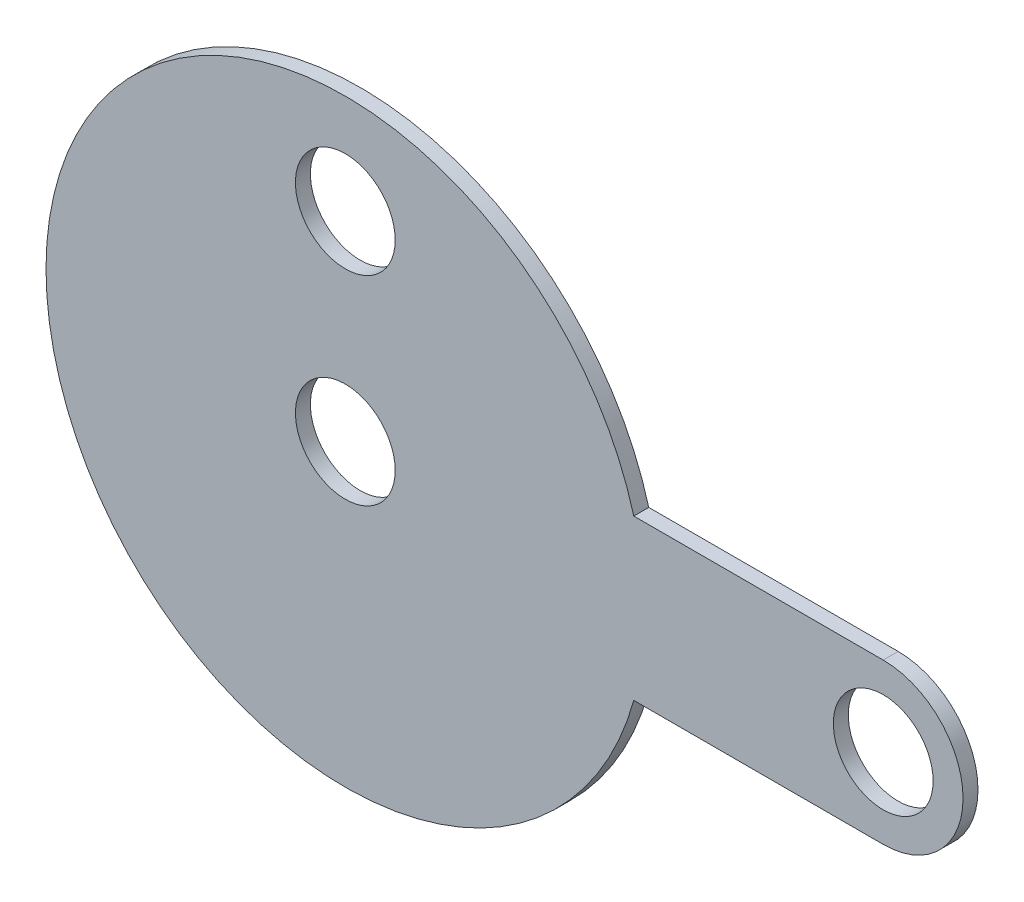
ISO-10303-21;
HEADER;
FILE_DESCRIPTION(('STEP AP214'),'2;1');
FILE_NAME('part.step','',(''),(''),'','','');
FILE_SCHEMA(('AUTOMOTIVE_DESIGN { 1 0 10303 214 1 1 1 1 }'));
ENDSEC;
DATA;
#1=APPLICATION_CONTEXT('core data for automotive mechanical design processes');
#2=APPLICATION_PROTOCOL_DEFINITION('international standard','automotive_design',2000,#1);
#3=PRODUCT_CONTEXT('',#1,'mechanical');
#4=PRODUCT('Part','Part','',(#3));
#5=PRODUCT_RELATED_PRODUCT_CATEGORY('part','',(#4));
#6=PRODUCT_DEFINITION_FORMATION('','',#4);
#7=PRODUCT_DEFINITION_CONTEXT('part definition',#1,'design');
#8=PRODUCT_DEFINITION('design','',#6,#7);
#9=PRODUCT_DEFINITION_SHAPE('','',#8);
#10=(LENGTH_UNIT() NAMED_UNIT(*) SI_UNIT(.MILLI.,.METRE.));
#11=(NAMED_UNIT(*) PLANE_ANGLE_UNIT() SI_UNIT($,.RADIAN.));
#12=(NAMED_UNIT(*) SI_UNIT($,.STERADIAN.) SOLID_ANGLE_UNIT());
#13=UNCERTAINTY_MEASURE_WITH_UNIT(LENGTH_MEASURE(1.E-05),#10,'distance_accuracy_value','');
#14=(GEOMETRIC_REPRESENTATION_CONTEXT(3) GLOBAL_UNCERTAINTY_ASSIGNED_CONTEXT((#13)) GLOBAL_UNIT_ASSIGNED_CONTEXT((#10,
#11,#12)) REPRESENTATION_CONTEXT('',''));
#15=CARTESIAN_POINT('',(0.,0.,0.));
#16=DIRECTION('',(0.,0.,1.));
#17=DIRECTION('',(1.,0.,0.));
#18=AXIS2_PLACEMENT_3D('',#15,#16,#17);
#19=CARTESIAN_POINT('',(53.9136644718086,0.,1.5));
#20=DIRECTION('',(0.,0.,1.));
#21=DIRECTION('',(1.,0.,0.));
#22=AXIS2_PLACEMENT_3D('',#19,#20,#21);
#23=PLANE('',#22);
#24=CARTESIAN_POINT('',(53.9136644718086,0.,1.5));
#25=DIRECTION('',(0.,0.,1.));
#26=DIRECTION('',(1.,0.,0.));
#27=AXIS2_PLACEMENT_3D('',#24,#25,#26);
#28=CIRCLE('',#27,5.);
#29=CARTESIAN_POINT('',(58.9136644718086,0.,1.5));
#30=VERTEX_POINT('',#29);
#31=EDGE_CURVE('E123',#30,#30,#28,.T.);
#32=ORIENTED_EDGE('',*,*,#31,.F.);
#33=EDGE_LOOP('',(#32));
#34=FACE_BOUND('',#33,.T.);
#35=CARTESIAN_POINT('',(53.9136644718086,0.,1.5));
#36=DIRECTION('',(0.,0.,1.));
#37=DIRECTION('',(1.,0.,0.));
#38=AXIS2_PLACEMENT_3D('',#35,#36,#37);
#39=CIRCLE('',#38,8.);
#40=CARTESIAN_POINT('',(53.9136645896019,-8.,1.5));
#41=VERTEX_POINT('',#40);
#42=CARTESIAN_POINT('',(53.9136645896019,8.,1.5));
#43=VERTEX_POINT('',#42);
#44=EDGE_CURVE('E93',#41,#43,#39,.T.);
#45=ORIENTED_EDGE('',*,*,#44,.T.);
#46=DIRECTION('',(-1.,0.,0.));
#47=VECTOR('',#46,1.);
#48=CARTESIAN_POINT('',(28.9136645896019,8.,1.5));
#49=LINE('',#48,#47);
#50=CARTESIAN_POINT('',(28.9136645896019,8.,1.5));
#51=VERTEX_POINT('',#50);
#52=EDGE_CURVE('E88',#43,#51,#49,.T.);
#53=ORIENTED_EDGE('',*,*,#52,.T.);
#54=CARTESIAN_POINT('',(0.,0.,1.5));
#55=DIRECTION('',(0.,0.,1.));
#56=DIRECTION('',(1.,0.,0.));
#57=AXIS2_PLACEMENT_3D('',#54,#55,#56);
#58=CIRCLE('',#57,30.);
#59=CARTESIAN_POINT('',(28.9136645896019,-8.00000000000001,1.5));
#60=VERTEX_POINT('',#59);
#61=EDGE_CURVE('E91',#51,#60,#58,.T.);
#62=ORIENTED_EDGE('',*,*,#61,.T.);
#63=DIRECTION('',(1.,0.,0.));
#64=VECTOR('',#63,1.);
#65=CARTESIAN_POINT('',(28.9136645896019,-8.,1.5));
#66=LINE('',#65,#64);
#67=EDGE_CURVE('E58',#60,#41,#66,.T.);
#68=ORIENTED_EDGE('',*,*,#67,.T.);
#69=EDGE_LOOP('',(#45,#53,#62,#68));
#70=FACE_BOUND('',#69,.T.);
#71=CARTESIAN_POINT('',(0.,0.,1.5));
#72=DIRECTION('',(0.,0.,1.));
#73=DIRECTION('',(1.,0.,0.));
#74=AXIS2_PLACEMENT_3D('',#71,#72,#73);
#75=CIRCLE('',#74,5.);
#76=CARTESIAN_POINT('',(5.,0.,1.5));
#77=VERTEX_POINT('',#76);
#78=EDGE_CURVE('E108',#77,#77,#75,.T.);
#79=ORIENTED_EDGE('',*,*,#78,.F.);
#80=EDGE_LOOP('',(#79));
#81=FACE_BOUND('',#80,.T.);
#82=CARTESIAN_POINT('',(0.,20.,1.5));
#83=DIRECTION('',(0.,0.,1.));
#84=DIRECTION('',(1.,0.,0.));
#85=AXIS2_PLACEMENT_3D('',#82,#83,#84);
#86=CIRCLE('',#85,5.);
#87=CARTESIAN_POINT('',(5.,20.,1.5));
#88=VERTEX_POINT('',#87);
#89=EDGE_CURVE('E129',#88,#88,#86,.T.);
#90=ORIENTED_EDGE('',*,*,#89,.F.);
#91=EDGE_LOOP('',(#90));
#92=FACE_BOUND('',#91,.T.);
#93=ADVANCED_FACE('F41',(#34,#70,#81,#92),#23,.T.);
#94=CARTESIAN_POINT('',(53.9136644718086,0.,0.));
#95=DIRECTION('',(0.,0.,1.));
#96=DIRECTION('',(1.,0.,0.));
#97=AXIS2_PLACEMENT_3D('',#94,#95,#96);
#98=PLANE('',#97);
#99=CARTESIAN_POINT('',(53.9136644718086,0.,0.));
#100=DIRECTION('',(0.,0.,1.));
#101=DIRECTION('',(1.,0.,0.));
#102=AXIS2_PLACEMENT_3D('',#99,#100,#101);
#103=CIRCLE('',#102,8.);
#104=CARTESIAN_POINT('',(53.9136645896019,-8.,0.));
#105=VERTEX_POINT('',#104);
#106=CARTESIAN_POINT('',(53.9136645896019,8.,0.));
#107=VERTEX_POINT('',#106);
#108=EDGE_CURVE('E105',#105,#107,#103,.T.);
#109=ORIENTED_EDGE('',*,*,#108,.F.);
#110=DIRECTION('',(1.,0.,0.));
#111=VECTOR('',#110,1.);
#112=CARTESIAN_POINT('',(28.9136645896019,-8.,0.));
#113=LINE('',#112,#111);
#114=CARTESIAN_POINT('',(28.9136645896019,-8.00000000000001,0.));
#115=VERTEX_POINT('',#114);
#116=EDGE_CURVE('E81',#115,#105,#113,.T.);
#117=ORIENTED_EDGE('',*,*,#116,.F.);
#118=CARTESIAN_POINT('',(0.,0.,0.));
#119=DIRECTION('',(0.,0.,1.));
#120=DIRECTION('',(1.,0.,0.));
#121=AXIS2_PLACEMENT_3D('',#118,#119,#120);
#122=CIRCLE('',#121,30.);
#123=CARTESIAN_POINT('',(28.9136645896019,8.,0.));
#124=VERTEX_POINT('',#123);
#125=EDGE_CURVE('E75',#124,#115,#122,.T.);
#126=ORIENTED_EDGE('',*,*,#125,.F.);
#127=DIRECTION('',(-1.,0.,0.));
#128=VECTOR('',#127,1.);
#129=CARTESIAN_POINT('',(28.9136645896019,8.,0.));
#130=LINE('',#129,#128);
#131=EDGE_CURVE('E97',#107,#124,#130,.T.);
#132=ORIENTED_EDGE('',*,*,#131,.F.);
#133=EDGE_LOOP('',(#109,#117,#126,#132));
#134=FACE_BOUND('',#133,.T.);
#135=CARTESIAN_POINT('',(0.,0.,0.));
#136=DIRECTION('',(0.,0.,1.));
#137=DIRECTION('',(1.,0.,0.));
#138=AXIS2_PLACEMENT_3D('',#135,#136,#137);
#139=CIRCLE('',#138,5.);
#140=CARTESIAN_POINT('',(5.,0.,0.));
#141=VERTEX_POINT('',#140);
#142=EDGE_CURVE('E120',#141,#141,#139,.T.);
#143=ORIENTED_EDGE('',*,*,#142,.T.);
#144=EDGE_LOOP('',(#143));
#145=FACE_BOUND('',#144,.T.);
#146=CARTESIAN_POINT('',(53.9136644718086,0.,0.));
#147=DIRECTION('',(0.,0.,1.));
#148=DIRECTION('',(1.,0.,0.));
#149=AXIS2_PLACEMENT_3D('',#146,#147,#148);
#150=CIRCLE('',#149,5.);
#151=CARTESIAN_POINT('',(58.9136644718086,0.,0.));
#152=VERTEX_POINT('',#151);
#153=EDGE_CURVE('E126',#152,#152,#150,.T.);
#154=ORIENTED_EDGE('',*,*,#153,.T.);
#155=EDGE_LOOP('',(#154));
#156=FACE_BOUND('',#155,.T.);
#157=CARTESIAN_POINT('',(0.,20.,0.));
#158=DIRECTION('',(0.,0.,1.));
#159=DIRECTION('',(1.,0.,0.));
#160=AXIS2_PLACEMENT_3D('',#157,#158,#159);
#161=CIRCLE('',#160,5.);
#162=CARTESIAN_POINT('',(5.,20.,0.));
#163=VERTEX_POINT('',#162);
#164=EDGE_CURVE('E132',#163,#163,#161,.T.);
#165=ORIENTED_EDGE('',*,*,#164,.T.);
#166=EDGE_LOOP('',(#165));
#167=FACE_BOUND('',#166,.T.);
#168=ADVANCED_FACE('F116',(#134,#145,#156,#167),#98,.F.);
#169=CARTESIAN_POINT('',(53.9136644718086,0.,1.5));
#170=DIRECTION('',(0.,0.,-1.));
#171=DIRECTION('',(-1.,0.,0.));
#172=AXIS2_PLACEMENT_3D('',#169,#170,#171);
#173=CYLINDRICAL_SURFACE('',#172,8.);
#174=ORIENTED_EDGE('',*,*,#108,.T.);
#175=DIRECTION('',(0.,0.,-1.));
#176=VECTOR('',#175,1.);
#177=CARTESIAN_POINT('',(53.9136645896019,8.,1.5));
#178=LINE('',#177,#176);
#179=EDGE_CURVE('E11',#43,#107,#178,.T.);
#180=ORIENTED_EDGE('',*,*,#179,.F.);
#181=ORIENTED_EDGE('',*,*,#44,.F.);
#182=DIRECTION('',(0.,0.,-1.));
#183=VECTOR('',#182,1.);
#184=CARTESIAN_POINT('',(53.9136645896019,-8.,1.5));
#185=LINE('',#184,#183);
#186=EDGE_CURVE('E101',#41,#105,#185,.T.);
#187=ORIENTED_EDGE('',*,*,#186,.T.);
#188=EDGE_LOOP('',(#174,#180,#181,#187));
#189=FACE_BOUND('',#188,.T.);
#190=ADVANCED_FACE('F43',(#189),#173,.T.);
#191=CARTESIAN_POINT('',(28.9136645896019,8.,1.5));
#192=DIRECTION('',(0.,-1.,0.));
#193=DIRECTION('',(0.,0.,-1.));
#194=AXIS2_PLACEMENT_3D('',#191,#192,#193);
#195=PLANE('',#194);
#196=ORIENTED_EDGE('',*,*,#131,.T.);
#197=DIRECTION('',(0.,0.,-1.));
#198=VECTOR('',#197,1.);
#199=CARTESIAN_POINT('',(28.9136645896019,8.,1.5));
#200=LINE('',#199,#198);
#201=EDGE_CURVE('E50',#51,#124,#200,.T.);
#202=ORIENTED_EDGE('',*,*,#201,.F.);
#203=ORIENTED_EDGE('',*,*,#52,.F.);
#204=ORIENTED_EDGE('',*,*,#179,.T.);
#205=EDGE_LOOP('',(#196,#202,#203,#204));
#206=FACE_BOUND('',#205,.T.);
#207=ADVANCED_FACE('F96',(#206),#195,.F.);
#208=CARTESIAN_POINT('',(0.,0.,1.5));
#209=DIRECTION('',(0.,0.,-1.));
#210=DIRECTION('',(-1.,0.,0.));
#211=AXIS2_PLACEMENT_3D('',#208,#209,#210);
#212=CYLINDRICAL_SURFACE('',#211,30.);
#213=ORIENTED_EDGE('',*,*,#125,.T.);
#214=DIRECTION('',(0.,0.,-1.));
#215=VECTOR('',#214,1.);
#216=CARTESIAN_POINT('',(28.9136645896019,-8.00000000000001,1.5));
#217=LINE('',#216,#215);
#218=EDGE_CURVE('E98',#60,#115,#217,.T.);
#219=ORIENTED_EDGE('',*,*,#218,.F.);
#220=ORIENTED_EDGE('',*,*,#61,.F.);
#221=ORIENTED_EDGE('',*,*,#201,.T.);
#222=EDGE_LOOP('',(#213,#219,#220,#221));
#223=FACE_BOUND('',#222,.T.);
#224=ADVANCED_FACE('F99',(#223),#212,.T.);
#225=CARTESIAN_POINT('',(28.9136645896019,-8.,1.5));
#226=DIRECTION('',(0.,1.,0.));
#227=DIRECTION('',(0.,0.,1.));
#228=AXIS2_PLACEMENT_3D('',#225,#226,#227);
#229=PLANE('',#228);
#230=ORIENTED_EDGE('',*,*,#116,.T.);
#231=ORIENTED_EDGE('',*,*,#186,.F.);
#232=ORIENTED_EDGE('',*,*,#67,.F.);
#233=ORIENTED_EDGE('',*,*,#218,.T.);
#234=EDGE_LOOP('',(#230,#231,#232,#233));
#235=FACE_BOUND('',#234,.T.);
#236=ADVANCED_FACE('F113',(#235),#229,.F.);
#237=CARTESIAN_POINT('',(0.,0.,1.5));
#238=DIRECTION('',(0.,0.,-1.));
#239=DIRECTION('',(-1.,0.,0.));
#240=AXIS2_PLACEMENT_3D('',#237,#238,#239);
#241=CYLINDRICAL_SURFACE('',#240,5.);
#242=ORIENTED_EDGE('',*,*,#78,.T.);
#243=EDGE_LOOP('',(#242));
#244=FACE_BOUND('',#243,.T.);
#245=ORIENTED_EDGE('',*,*,#142,.F.);
#246=EDGE_LOOP('',(#245));
#247=FACE_BOUND('',#246,.T.);
#248=ADVANCED_FACE('F150',(#244,#247),#241,.F.);
#249=CARTESIAN_POINT('',(53.9136644718086,0.,1.5));
#250=DIRECTION('',(0.,0.,-1.));
#251=DIRECTION('',(-1.,0.,0.));
#252=AXIS2_PLACEMENT_3D('',#249,#250,#251);
#253=CYLINDRICAL_SURFACE('',#252,5.);
#254=ORIENTED_EDGE('',*,*,#31,.T.);
#255=EDGE_LOOP('',(#254));
#256=FACE_BOUND('',#255,.T.);
#257=ORIENTED_EDGE('',*,*,#153,.F.);
#258=EDGE_LOOP('',(#257));
#259=FACE_BOUND('',#258,.T.);
#260=ADVANCED_FACE('F204',(#256,#259),#253,.F.);
#261=CARTESIAN_POINT('',(0.,20.,1.5));
#262=DIRECTION('',(0.,0.,-1.));
#263=DIRECTION('',(-1.,0.,0.));
#264=AXIS2_PLACEMENT_3D('',#261,#262,#263);
#265=CYLINDRICAL_SURFACE('',#264,5.);
#266=ORIENTED_EDGE('',*,*,#89,.T.);
#267=EDGE_LOOP('',(#266));
#268=FACE_BOUND('',#267,.T.);
#269=ORIENTED_EDGE('',*,*,#164,.F.);
#270=EDGE_LOOP('',(#269));
#271=FACE_BOUND('',#270,.T.);
#272=ADVANCED_FACE('F138',(#268,#271),#265,.F.);
#273=CLOSED_SHELL('',(#93,#168,#190,#207,#224,#236,#248,#260,#272));
#274=MANIFOLD_SOLID_BREP('B2',#273);
#275=ADVANCED_BREP_SHAPE_REPRESENTATION('',(#18,#274),#14);
#276=SHAPE_DEFINITION_REPRESENTATION(#9,#275);
ENDSEC;
END-ISO-10303-21;
